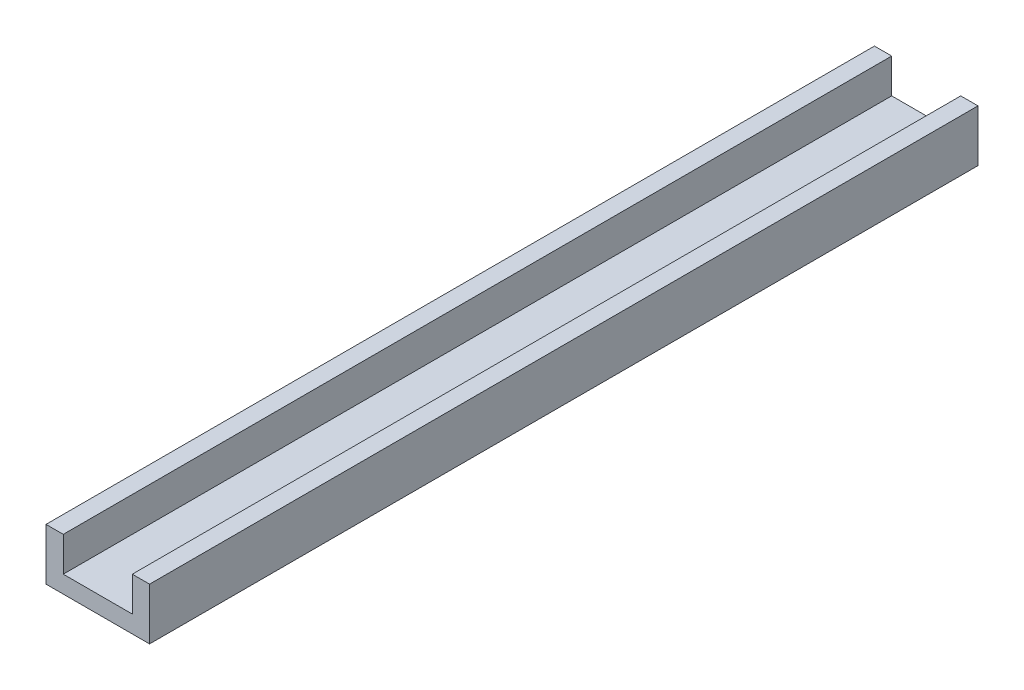
ISO-10303-21;
HEADER;
FILE_DESCRIPTION(('STEP AP214'),'2;1');
FILE_NAME('part.step','',(''),(''),'','','');
FILE_SCHEMA(('AUTOMOTIVE_DESIGN { 1 0 10303 214 1 1 1 1 }'));
ENDSEC;
DATA;
#1=APPLICATION_CONTEXT('core data for automotive mechanical design processes');
#2=APPLICATION_PROTOCOL_DEFINITION('international standard','automotive_design',2000,#1);
#3=PRODUCT_CONTEXT('',#1,'mechanical');
#4=PRODUCT('Part','Part','',(#3));
#5=PRODUCT_RELATED_PRODUCT_CATEGORY('part','',(#4));
#6=PRODUCT_DEFINITION_FORMATION('','',#4);
#7=PRODUCT_DEFINITION_CONTEXT('part definition',#1,'design');
#8=PRODUCT_DEFINITION('design','',#6,#7);
#9=PRODUCT_DEFINITION_SHAPE('','',#8);
#10=(LENGTH_UNIT() NAMED_UNIT(*) SI_UNIT(.MILLI.,.METRE.));
#11=(NAMED_UNIT(*) PLANE_ANGLE_UNIT() SI_UNIT($,.RADIAN.));
#12=(NAMED_UNIT(*) SI_UNIT($,.STERADIAN.) SOLID_ANGLE_UNIT());
#13=UNCERTAINTY_MEASURE_WITH_UNIT(LENGTH_MEASURE(1.E-05),#10,'distance_accuracy_value','');
#14=(GEOMETRIC_REPRESENTATION_CONTEXT(3) GLOBAL_UNCERTAINTY_ASSIGNED_CONTEXT((#13)) GLOBAL_UNIT_ASSIGNED_CONTEXT((#10,
#11,#12)) REPRESENTATION_CONTEXT('',''));
#15=CARTESIAN_POINT('',(0.,0.,0.));
#16=DIRECTION('',(0.,0.,1.));
#17=DIRECTION('',(1.,0.,0.));
#18=AXIS2_PLACEMENT_3D('',#15,#16,#17);
#19=CARTESIAN_POINT('',(0.,19.05,304.8));
#20=DIRECTION('',(0.,-1.,0.));
#21=DIRECTION('',(0.,0.,-1.));
#22=AXIS2_PLACEMENT_3D('',#19,#20,#21);
#23=PLANE('',#22);
#24=DIRECTION('',(-1.,0.,0.));
#25=VECTOR('',#24,1.);
#26=CARTESIAN_POINT('',(0.,19.05,304.8));
#27=LINE('',#26,#25);
#28=CARTESIAN_POINT('',(6.35,19.05,304.8));
#29=VERTEX_POINT('',#28);
#30=CARTESIAN_POINT('',(0.,19.05,304.8));
#31=VERTEX_POINT('',#30);
#32=EDGE_CURVE('E57',#29,#31,#27,.T.);
#33=ORIENTED_EDGE('',*,*,#32,.F.);
#34=DIRECTION('',(0.,0.,1.));
#35=VECTOR('',#34,1.);
#36=CARTESIAN_POINT('',(6.35,19.05,-0.000999999999973245));
#37=LINE('',#36,#35);
#38=CARTESIAN_POINT('',(6.35,19.05,0.));
#39=VERTEX_POINT('',#38);
#40=EDGE_CURVE('E118',#39,#29,#37,.T.);
#41=ORIENTED_EDGE('',*,*,#40,.F.);
#42=DIRECTION('',(-1.,0.,0.));
#43=VECTOR('',#42,1.);
#44=CARTESIAN_POINT('',(0.,19.05,0.));
#45=LINE('',#44,#43);
#46=CARTESIAN_POINT('',(0.,19.05,0.));
#47=VERTEX_POINT('',#46);
#48=EDGE_CURVE('E79',#39,#47,#45,.T.);
#49=ORIENTED_EDGE('',*,*,#48,.T.);
#50=DIRECTION('',(0.,0.,-1.));
#51=VECTOR('',#50,1.);
#52=CARTESIAN_POINT('',(0.,19.05,304.8));
#53=LINE('',#52,#51);
#54=EDGE_CURVE('E140',#31,#47,#53,.T.);
#55=ORIENTED_EDGE('',*,*,#54,.F.);
#56=EDGE_LOOP('',(#33,#41,#49,#55));
#57=FACE_BOUND('',#56,.T.);
#58=ADVANCED_FACE('F33',(#57),#23,.F.);
#59=CARTESIAN_POINT('',(0.,0.,304.8));
#60=DIRECTION('',(1.,0.,0.));
#61=DIRECTION('',(0.,0.,-1.));
#62=AXIS2_PLACEMENT_3D('',#59,#60,#61);
#63=PLANE('',#62);
#64=DIRECTION('',(0.,-1.,0.));
#65=VECTOR('',#64,1.);
#66=CARTESIAN_POINT('',(0.,0.,0.));
#67=LINE('',#66,#65);
#68=CARTESIAN_POINT('',(0.,0.,0.));
#69=VERTEX_POINT('',#68);
#70=EDGE_CURVE('E150',#47,#69,#67,.T.);
#71=ORIENTED_EDGE('',*,*,#70,.T.);
#72=DIRECTION('',(0.,0.,-1.));
#73=VECTOR('',#72,1.);
#74=CARTESIAN_POINT('',(0.,0.,304.8));
#75=LINE('',#74,#73);
#76=CARTESIAN_POINT('',(0.,0.,304.8));
#77=VERTEX_POINT('',#76);
#78=EDGE_CURVE('E11',#77,#69,#75,.T.);
#79=ORIENTED_EDGE('',*,*,#78,.F.);
#80=DIRECTION('',(0.,-1.,0.));
#81=VECTOR('',#80,1.);
#82=CARTESIAN_POINT('',(0.,0.,304.8));
#83=LINE('',#82,#81);
#84=EDGE_CURVE('E133',#31,#77,#83,.T.);
#85=ORIENTED_EDGE('',*,*,#84,.F.);
#86=ORIENTED_EDGE('',*,*,#54,.T.);
#87=EDGE_LOOP('',(#71,#79,#85,#86));
#88=FACE_BOUND('',#87,.T.);
#89=ADVANCED_FACE('F35',(#88),#63,.F.);
#90=CARTESIAN_POINT('',(0.,0.,304.8));
#91=DIRECTION('',(0.,1.,0.));
#92=DIRECTION('',(0.,0.,1.));
#93=AXIS2_PLACEMENT_3D('',#90,#91,#92);
#94=PLANE('',#93);
#95=DIRECTION('',(1.,0.,0.));
#96=VECTOR('',#95,1.);
#97=CARTESIAN_POINT('',(0.,0.,0.));
#98=LINE('',#97,#96);
#99=CARTESIAN_POINT('',(38.1,0.,0.));
#100=VERTEX_POINT('',#99);
#101=EDGE_CURVE('E149',#69,#100,#98,.T.);
#102=ORIENTED_EDGE('',*,*,#101,.T.);
#103=DIRECTION('',(0.,0.,-1.));
#104=VECTOR('',#103,1.);
#105=CARTESIAN_POINT('',(38.1,0.,304.8));
#106=LINE('',#105,#104);
#107=CARTESIAN_POINT('',(38.1,0.,304.8));
#108=VERTEX_POINT('',#107);
#109=EDGE_CURVE('E41',#108,#100,#106,.T.);
#110=ORIENTED_EDGE('',*,*,#109,.F.);
#111=DIRECTION('',(1.,0.,0.));
#112=VECTOR('',#111,1.);
#113=CARTESIAN_POINT('',(0.,0.,304.8));
#114=LINE('',#113,#112);
#115=EDGE_CURVE('E86',#77,#108,#114,.T.);
#116=ORIENTED_EDGE('',*,*,#115,.F.);
#117=ORIENTED_EDGE('',*,*,#78,.T.);
#118=EDGE_LOOP('',(#102,#110,#116,#117));
#119=FACE_BOUND('',#118,.T.);
#120=ADVANCED_FACE('F189',(#119),#94,.F.);
#121=CARTESIAN_POINT('',(38.1,0.,304.8));
#122=DIRECTION('',(-1.,0.,0.));
#123=DIRECTION('',(0.,0.,1.));
#124=AXIS2_PLACEMENT_3D('',#121,#122,#123);
#125=PLANE('',#124);
#126=DIRECTION('',(0.,1.,0.));
#127=VECTOR('',#126,1.);
#128=CARTESIAN_POINT('',(38.1,0.,0.));
#129=LINE('',#128,#127);
#130=CARTESIAN_POINT('',(38.1,19.05,0.));
#131=VERTEX_POINT('',#130);
#132=EDGE_CURVE('E136',#100,#131,#129,.T.);
#133=ORIENTED_EDGE('',*,*,#132,.T.);
#134=DIRECTION('',(0.,0.,-1.));
#135=VECTOR('',#134,1.);
#136=CARTESIAN_POINT('',(38.1,19.05,304.8));
#137=LINE('',#136,#135);
#138=CARTESIAN_POINT('',(38.1,19.05,304.8));
#139=VERTEX_POINT('',#138);
#140=EDGE_CURVE('E132',#139,#131,#137,.T.);
#141=ORIENTED_EDGE('',*,*,#140,.F.);
#142=DIRECTION('',(0.,1.,0.));
#143=VECTOR('',#142,1.);
#144=CARTESIAN_POINT('',(38.1,0.,304.8));
#145=LINE('',#144,#143);
#146=EDGE_CURVE('E147',#108,#139,#145,.T.);
#147=ORIENTED_EDGE('',*,*,#146,.F.);
#148=ORIENTED_EDGE('',*,*,#109,.T.);
#149=EDGE_LOOP('',(#133,#141,#147,#148));
#150=FACE_BOUND('',#149,.T.);
#151=ADVANCED_FACE('F146',(#150),#125,.F.);
#152=CARTESIAN_POINT('',(31.75,19.05,0.));
#153=VERTEX_POINT('',#152);
#154=EDGE_CURVE('E125',#131,#153,#45,.T.);
#155=ORIENTED_EDGE('',*,*,#154,.T.);
#156=DIRECTION('',(0.,0.,1.));
#157=VECTOR('',#156,1.);
#158=CARTESIAN_POINT('',(31.75,19.05,-0.000999999999973245));
#159=LINE('',#158,#157);
#160=CARTESIAN_POINT('',(31.75,19.05,304.8));
#161=VERTEX_POINT('',#160);
#162=EDGE_CURVE('E107',#153,#161,#159,.T.);
#163=ORIENTED_EDGE('',*,*,#162,.T.);
#164=EDGE_CURVE('E142',#139,#161,#27,.T.);
#165=ORIENTED_EDGE('',*,*,#164,.F.);
#166=ORIENTED_EDGE('',*,*,#140,.T.);
#167=EDGE_LOOP('',(#155,#163,#165,#166));
#168=FACE_BOUND('',#167,.T.);
#169=ADVANCED_FACE('F130',(#168),#23,.F.);
#170=CARTESIAN_POINT('',(0.,0.,304.8));
#171=DIRECTION('',(0.,0.,-1.));
#172=DIRECTION('',(-1.,0.,0.));
#173=AXIS2_PLACEMENT_3D('',#170,#171,#172);
#174=PLANE('',#173);
#175=DIRECTION('',(1.,0.,0.));
#176=VECTOR('',#175,1.);
#177=CARTESIAN_POINT('',(6.35,6.35,304.8));
#178=LINE('',#177,#176);
#179=CARTESIAN_POINT('',(6.35,6.35,304.8));
#180=VERTEX_POINT('',#179);
#181=CARTESIAN_POINT('',(31.75,6.35,304.8));
#182=VERTEX_POINT('',#181);
#183=EDGE_CURVE('E163',#180,#182,#178,.T.);
#184=ORIENTED_EDGE('',*,*,#183,.F.);
#185=DIRECTION('',(0.,-1.,0.));
#186=VECTOR('',#185,1.);
#187=CARTESIAN_POINT('',(6.35,19.05,304.8));
#188=LINE('',#187,#186);
#189=EDGE_CURVE('E165',#29,#180,#188,.T.);
#190=ORIENTED_EDGE('',*,*,#189,.F.);
#191=ORIENTED_EDGE('',*,*,#32,.T.);
#192=ORIENTED_EDGE('',*,*,#84,.T.);
#193=ORIENTED_EDGE('',*,*,#115,.T.);
#194=ORIENTED_EDGE('',*,*,#146,.T.);
#195=ORIENTED_EDGE('',*,*,#164,.T.);
#196=DIRECTION('',(0.,1.,0.));
#197=VECTOR('',#196,1.);
#198=CARTESIAN_POINT('',(31.75,19.05,304.8));
#199=LINE('',#198,#197);
#200=EDGE_CURVE('E113',#182,#161,#199,.T.);
#201=ORIENTED_EDGE('',*,*,#200,.F.);
#202=EDGE_LOOP('',(#184,#190,#191,#192,#193,#194,#195,#201));
#203=FACE_BOUND('',#202,.T.);
#204=ADVANCED_FACE('F175',(#203),#174,.F.);
#205=CARTESIAN_POINT('',(0.,0.,0.));
#206=DIRECTION('',(0.,0.,-1.));
#207=DIRECTION('',(-1.,0.,0.));
#208=AXIS2_PLACEMENT_3D('',#205,#206,#207);
#209=PLANE('',#208);
#210=DIRECTION('',(0.,-1.,0.));
#211=VECTOR('',#210,1.);
#212=CARTESIAN_POINT('',(6.35,19.05,0.));
#213=LINE('',#212,#211);
#214=CARTESIAN_POINT('',(6.35,6.35,0.));
#215=VERTEX_POINT('',#214);
#216=EDGE_CURVE('E127',#39,#215,#213,.T.);
#217=ORIENTED_EDGE('',*,*,#216,.T.);
#218=DIRECTION('',(1.,0.,0.));
#219=VECTOR('',#218,1.);
#220=CARTESIAN_POINT('',(6.35,6.35,0.));
#221=LINE('',#220,#219);
#222=CARTESIAN_POINT('',(31.75,6.35,0.));
#223=VERTEX_POINT('',#222);
#224=EDGE_CURVE('E126',#215,#223,#221,.T.);
#225=ORIENTED_EDGE('',*,*,#224,.T.);
#226=DIRECTION('',(0.,1.,0.));
#227=VECTOR('',#226,1.);
#228=CARTESIAN_POINT('',(31.75,19.05,0.));
#229=LINE('',#228,#227);
#230=EDGE_CURVE('E110',#223,#153,#229,.T.);
#231=ORIENTED_EDGE('',*,*,#230,.T.);
#232=ORIENTED_EDGE('',*,*,#154,.F.);
#233=ORIENTED_EDGE('',*,*,#132,.F.);
#234=ORIENTED_EDGE('',*,*,#101,.F.);
#235=ORIENTED_EDGE('',*,*,#70,.F.);
#236=ORIENTED_EDGE('',*,*,#48,.F.);
#237=EDGE_LOOP('',(#217,#225,#231,#232,#233,#234,#235,#236));
#238=FACE_BOUND('',#237,.T.);
#239=ADVANCED_FACE('F123',(#238),#209,.T.);
#240=CARTESIAN_POINT('',(6.35,19.05,-0.000999999999973245));
#241=DIRECTION('',(-1.,0.,0.));
#242=DIRECTION('',(0.,0.,1.));
#243=AXIS2_PLACEMENT_3D('',#240,#241,#242);
#244=PLANE('',#243);
#245=ORIENTED_EDGE('',*,*,#40,.T.);
#246=ORIENTED_EDGE('',*,*,#189,.T.);
#247=DIRECTION('',(0.,0.,1.));
#248=VECTOR('',#247,1.);
#249=CARTESIAN_POINT('',(6.35,6.35,-0.000999999999973245));
#250=LINE('',#249,#248);
#251=EDGE_CURVE('E158',#215,#180,#250,.T.);
#252=ORIENTED_EDGE('',*,*,#251,.F.);
#253=ORIENTED_EDGE('',*,*,#216,.F.);
#254=EDGE_LOOP('',(#245,#246,#252,#253));
#255=FACE_BOUND('',#254,.T.);
#256=ADVANCED_FACE('F170',(#255),#244,.F.);
#257=CARTESIAN_POINT('',(31.75,19.05,-0.000999999999973245));
#258=DIRECTION('',(1.,0.,0.));
#259=DIRECTION('',(0.,0.,-1.));
#260=AXIS2_PLACEMENT_3D('',#257,#258,#259);
#261=PLANE('',#260);
#262=DIRECTION('',(0.,0.,1.));
#263=VECTOR('',#262,1.);
#264=CARTESIAN_POINT('',(31.75,6.35,-0.000999999999973245));
#265=LINE('',#264,#263);
#266=EDGE_CURVE('E48',#223,#182,#265,.T.);
#267=ORIENTED_EDGE('',*,*,#266,.T.);
#268=ORIENTED_EDGE('',*,*,#200,.T.);
#269=ORIENTED_EDGE('',*,*,#162,.F.);
#270=ORIENTED_EDGE('',*,*,#230,.F.);
#271=EDGE_LOOP('',(#267,#268,#269,#270));
#272=FACE_BOUND('',#271,.T.);
#273=ADVANCED_FACE('F109',(#272),#261,.F.);
#274=CARTESIAN_POINT('',(6.35,6.35,-0.000999999999973245));
#275=DIRECTION('',(0.,-1.,0.));
#276=DIRECTION('',(0.,0.,-1.));
#277=AXIS2_PLACEMENT_3D('',#274,#275,#276);
#278=PLANE('',#277);
#279=ORIENTED_EDGE('',*,*,#251,.T.);
#280=ORIENTED_EDGE('',*,*,#183,.T.);
#281=ORIENTED_EDGE('',*,*,#266,.F.);
#282=ORIENTED_EDGE('',*,*,#224,.F.);
#283=EDGE_LOOP('',(#279,#280,#281,#282));
#284=FACE_BOUND('',#283,.T.);
#285=ADVANCED_FACE('F176',(#284),#278,.F.);
#286=CLOSED_SHELL('',(#58,#89,#120,#151,#169,#204,#239,#256,#273,#285));
#287=MANIFOLD_SOLID_BREP('B2',#286);
#288=ADVANCED_BREP_SHAPE_REPRESENTATION('',(#18,#287),#14);
#289=SHAPE_DEFINITION_REPRESENTATION(#9,#288);
ENDSEC;
END-ISO-10303-21;
